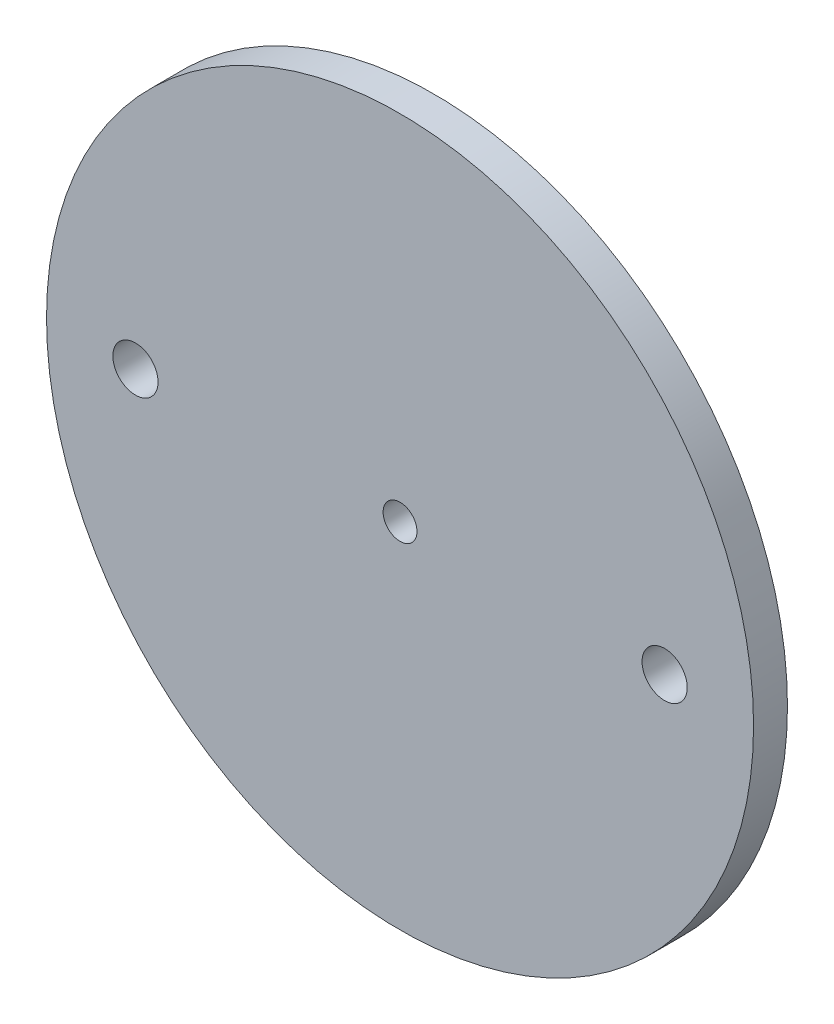
ISO-10303-21;
HEADER;
FILE_DESCRIPTION(('STEP AP214'),'2;1');
FILE_NAME('part.step','',(''),(''),'','','');
FILE_SCHEMA(('AUTOMOTIVE_DESIGN { 1 0 10303 214 1 1 1 1 }'));
ENDSEC;
DATA;
#1=APPLICATION_CONTEXT('core data for automotive mechanical design processes');
#2=APPLICATION_PROTOCOL_DEFINITION('international standard','automotive_design',2000,#1);
#3=PRODUCT_CONTEXT('',#1,'mechanical');
#4=PRODUCT('Part','Part','',(#3));
#5=PRODUCT_RELATED_PRODUCT_CATEGORY('part','',(#4));
#6=PRODUCT_DEFINITION_FORMATION('','',#4);
#7=PRODUCT_DEFINITION_CONTEXT('part definition',#1,'design');
#8=PRODUCT_DEFINITION('design','',#6,#7);
#9=PRODUCT_DEFINITION_SHAPE('','',#8);
#10=(LENGTH_UNIT() NAMED_UNIT(*) SI_UNIT(.MILLI.,.METRE.));
#11=(NAMED_UNIT(*) PLANE_ANGLE_UNIT() SI_UNIT($,.RADIAN.));
#12=(NAMED_UNIT(*) SI_UNIT($,.STERADIAN.) SOLID_ANGLE_UNIT());
#13=UNCERTAINTY_MEASURE_WITH_UNIT(LENGTH_MEASURE(1.E-05),#10,'distance_accuracy_value','');
#14=(GEOMETRIC_REPRESENTATION_CONTEXT(3) GLOBAL_UNCERTAINTY_ASSIGNED_CONTEXT((#13)) GLOBAL_UNIT_ASSIGNED_CONTEXT((#10,
#11,#12)) REPRESENTATION_CONTEXT('',''));
#15=CARTESIAN_POINT('',(0.,0.,0.));
#16=DIRECTION('',(0.,0.,1.));
#17=DIRECTION('',(1.,0.,0.));
#18=AXIS2_PLACEMENT_3D('',#15,#16,#17);
#19=CARTESIAN_POINT('',(0.,0.,4.7625));
#20=DIRECTION('',(0.,0.,-1.));
#21=DIRECTION('',(-1.,0.,0.));
#22=AXIS2_PLACEMENT_3D('',#19,#20,#21);
#23=CYLINDRICAL_SURFACE('',#22,49.6697);
#24=CARTESIAN_POINT('',(0.,0.,4.7625));
#25=DIRECTION('',(0.,0.,1.));
#26=DIRECTION('',(1.,0.,0.));
#27=AXIS2_PLACEMENT_3D('',#24,#25,#26);
#28=CIRCLE('',#27,49.6697);
#29=CARTESIAN_POINT('',(-49.6697,0.,4.7625));
#30=VERTEX_POINT('',#29);
#31=EDGE_CURVE('E10',#30,#30,#28,.T.);
#32=CARTESIAN_POINT('',(0.,0.,0.));
#33=DIRECTION('',(0.,0.,1.));
#34=DIRECTION('',(1.,0.,0.));
#35=AXIS2_PLACEMENT_3D('',#32,#33,#34);
#36=CIRCLE('',#35,49.6697);
#37=CARTESIAN_POINT('',(-49.6697,0.,0.));
#38=VERTEX_POINT('',#37);
#39=EDGE_CURVE('E37',#38,#38,#36,.T.);
#40=CARTESIAN_POINT('',(-49.6697,0.,4.7625));
#41=CARTESIAN_POINT('',(-49.6697,0.,4.712890625));
#42=CARTESIAN_POINT('',(-49.6697,0.,4.66328125));
#43=CARTESIAN_POINT('',(-49.6697,0.,4.5640625));
#44=CARTESIAN_POINT('',(-49.6697,0.,4.514453125));
#45=CARTESIAN_POINT('',(-49.6697,0.,4.415234375));
#46=CARTESIAN_POINT('',(-49.6697,0.,4.365625));
#47=CARTESIAN_POINT('',(-49.6697,0.,4.26640625));
#48=CARTESIAN_POINT('',(-49.6697,0.,4.216796875));
#49=CARTESIAN_POINT('',(-49.6697,0.,4.117578125));
#50=CARTESIAN_POINT('',(-49.6697,0.,4.06796875));
#51=CARTESIAN_POINT('',(-49.6697,0.,3.96875));
#52=CARTESIAN_POINT('',(-49.6697,0.,3.919140625));
#53=CARTESIAN_POINT('',(-49.6697,0.,3.819921875));
#54=CARTESIAN_POINT('',(-49.6697,0.,3.7703125));
#55=CARTESIAN_POINT('',(-49.6697,0.,3.67109375));
#56=CARTESIAN_POINT('',(-49.6697,0.,3.621484375));
#57=CARTESIAN_POINT('',(-49.6697,0.,3.522265625));
#58=CARTESIAN_POINT('',(-49.6697,0.,3.47265625));
#59=CARTESIAN_POINT('',(-49.6697,0.,3.3734375));
#60=CARTESIAN_POINT('',(-49.6697,0.,3.323828125));
#61=CARTESIAN_POINT('',(-49.6697,0.,3.224609375));
#62=CARTESIAN_POINT('',(-49.6697,0.,3.175));
#63=CARTESIAN_POINT('',(-49.6697,0.,3.07578125));
#64=CARTESIAN_POINT('',(-49.6697,0.,3.026171875));
#65=CARTESIAN_POINT('',(-49.6697,0.,2.926953125));
#66=CARTESIAN_POINT('',(-49.6697,0.,2.87734375));
#67=CARTESIAN_POINT('',(-49.6697,0.,2.778125));
#68=CARTESIAN_POINT('',(-49.6697,0.,2.728515625));
#69=CARTESIAN_POINT('',(-49.6697,0.,2.629296875));
#70=CARTESIAN_POINT('',(-49.6697,0.,2.5796875));
#71=CARTESIAN_POINT('',(-49.6697,0.,2.48046875));
#72=CARTESIAN_POINT('',(-49.6697,0.,2.430859375));
#73=CARTESIAN_POINT('',(-49.6697,0.,2.331640625));
#74=CARTESIAN_POINT('',(-49.6697,0.,2.28203125));
#75=CARTESIAN_POINT('',(-49.6697,0.,2.1828125));
#76=CARTESIAN_POINT('',(-49.6697,0.,2.133203125));
#77=CARTESIAN_POINT('',(-49.6697,0.,2.033984375));
#78=CARTESIAN_POINT('',(-49.6697,0.,1.984375));
#79=CARTESIAN_POINT('',(-49.6697,0.,1.88515625));
#80=CARTESIAN_POINT('',(-49.6697,0.,1.835546875));
#81=CARTESIAN_POINT('',(-49.6697,0.,1.736328125));
#82=CARTESIAN_POINT('',(-49.6697,0.,1.68671875));
#83=CARTESIAN_POINT('',(-49.6697,0.,1.5875));
#84=CARTESIAN_POINT('',(-49.6697,0.,1.537890625));
#85=CARTESIAN_POINT('',(-49.6697,0.,1.438671875));
#86=CARTESIAN_POINT('',(-49.6697,0.,1.3890625));
#87=CARTESIAN_POINT('',(-49.6697,0.,1.28984375));
#88=CARTESIAN_POINT('',(-49.6697,0.,1.240234375));
#89=CARTESIAN_POINT('',(-49.6697,0.,1.141015625));
#90=CARTESIAN_POINT('',(-49.6697,0.,1.09140625));
#91=CARTESIAN_POINT('',(-49.6697,0.,0.9921875));
#92=CARTESIAN_POINT('',(-49.6697,0.,0.942578125));
#93=CARTESIAN_POINT('',(-49.6697,0.,0.843359375));
#94=CARTESIAN_POINT('',(-49.6697,0.,0.79375));
#95=CARTESIAN_POINT('',(-49.6697,0.,0.69453125));
#96=CARTESIAN_POINT('',(-49.6697,0.,0.644921875));
#97=CARTESIAN_POINT('',(-49.6697,0.,0.545703125));
#98=CARTESIAN_POINT('',(-49.6697,0.,0.49609375));
#99=CARTESIAN_POINT('',(-49.6697,0.,0.396875));
#100=CARTESIAN_POINT('',(-49.6697,0.,0.347265625));
#101=CARTESIAN_POINT('',(-49.6697,0.,0.248046875));
#102=CARTESIAN_POINT('',(-49.6697,0.,0.1984375));
#103=CARTESIAN_POINT('',(-49.6697,0.,0.09921875));
#104=CARTESIAN_POINT('',(-49.6697,0.,0.049609375));
#105=CARTESIAN_POINT('',(-49.6697,0.,0.));
#106=B_SPLINE_CURVE_WITH_KNOTS('',3,(#40,#41,#42,#43,#44,#45,#46,#47,#48,#49,#50,#51,#52,#53,
#54,#55,#56,#57,#58,#59,#60,#61,#62,#63,#64,#65,#66,#67,#68,#69,#70,#71,#72,#73,#74,#75,#76,#77,
#78,#79,#80,#81,#82,#83,#84,#85,#86,#87,#88,#89,#90,#91,#92,#93,#94,#95,#96,#97,#98,#99,#100,
#101,#102,#103,#104,#105),.UNSPECIFIED.,.F.,.F.,(4,2,2,2,2,2,2,2,2,2,2,2,2,2,2,2,2,2,2,2,2,2,2,
2,2,2,2,2,2,2,2,2,4),(0.,0.148828124999999,0.297656249999999,0.446484374999999,
0.595312499999999,0.744140625,0.89296875,1.041796875,1.190625,1.339453125,1.48828125,
1.637109375,1.7859375,1.934765625,2.08359375,2.232421875,2.38125,2.530078125,2.67890625,
2.827734375,2.9765625,3.125390625,3.27421875,3.423046875,3.571875,3.720703125,3.86953125,
4.018359375,4.1671875,4.316015625,4.46484375,4.613671875,4.7625),.UNSPECIFIED.);
#107=EDGE_CURVE('BSEAM34',#30,#38,#106,.T.);
#108=ORIENTED_EDGE('',*,*,#31,.F.);
#109=ORIENTED_EDGE('',*,*,#39,.T.);
#110=ORIENTED_EDGE('',*,*,#107,.T.);
#111=ORIENTED_EDGE('',*,*,#107,.F.);
#112=EDGE_LOOP('',(#108,#110,#109,#111));
#113=FACE_BOUND('',#112,.T.);
#114=ADVANCED_FACE('F34',(#113),#23,.T.);
#115=CARTESIAN_POINT('',(0.,0.,4.7625));
#116=DIRECTION('',(0.,0.,1.));
#117=DIRECTION('',(1.,0.,0.));
#118=AXIS2_PLACEMENT_3D('',#115,#116,#117);
#119=PLANE('',#118);
#120=CARTESIAN_POINT('',(-37.1729,0.,4.7625));
#121=DIRECTION('',(0.,0.,1.));
#122=DIRECTION('',(1.,0.,0.));
#123=AXIS2_PLACEMENT_3D('',#120,#121,#122);
#124=CIRCLE('',#123,3.17500000000001);
#125=CARTESIAN_POINT('',(-33.9979,0.,4.7625));
#126=VERTEX_POINT('',#125);
#127=EDGE_CURVE('E58',#126,#126,#124,.T.);
#128=ORIENTED_EDGE('',*,*,#127,.F.);
#129=EDGE_LOOP('',(#128));
#130=FACE_BOUND('',#129,.T.);
#131=CARTESIAN_POINT('',(37.1729,0.,4.7625));
#132=DIRECTION('',(0.,0.,1.));
#133=DIRECTION('',(1.,0.,0.));
#134=AXIS2_PLACEMENT_3D('',#131,#132,#133);
#135=CIRCLE('',#134,3.17500000000001);
#136=CARTESIAN_POINT('',(40.3479,0.,4.7625));
#137=VERTEX_POINT('',#136);
#138=EDGE_CURVE('E52',#137,#137,#135,.T.);
#139=ORIENTED_EDGE('',*,*,#138,.F.);
#140=EDGE_LOOP('',(#139));
#141=FACE_BOUND('',#140,.T.);
#142=CARTESIAN_POINT('',(0.,0.,4.7625));
#143=DIRECTION('',(0.,0.,1.));
#144=DIRECTION('',(1.,0.,0.));
#145=AXIS2_PLACEMENT_3D('',#142,#143,#144);
#146=CIRCLE('',#145,2.38125);
#147=CARTESIAN_POINT('',(2.38125,0.,4.7625));
#148=VERTEX_POINT('',#147);
#149=EDGE_CURVE('E46',#148,#148,#146,.T.);
#150=ORIENTED_EDGE('',*,*,#149,.F.);
#151=EDGE_LOOP('',(#150));
#152=FACE_BOUND('',#151,.T.);
#153=ORIENTED_EDGE('',*,*,#31,.T.);
#154=EDGE_LOOP('',(#153));
#155=FACE_BOUND('',#154,.T.);
#156=ADVANCED_FACE('F74',(#130,#141,#152,#155),#119,.T.);
#157=CARTESIAN_POINT('',(0.,0.,0.));
#158=DIRECTION('',(0.,0.,1.));
#159=DIRECTION('',(1.,0.,0.));
#160=AXIS2_PLACEMENT_3D('',#157,#158,#159);
#161=PLANE('',#160);
#162=CARTESIAN_POINT('',(-37.1729,0.,0.));
#163=DIRECTION('',(0.,0.,1.));
#164=DIRECTION('',(1.,0.,0.));
#165=AXIS2_PLACEMENT_3D('',#162,#163,#164);
#166=CIRCLE('',#165,3.17500000000001);
#167=CARTESIAN_POINT('',(-33.9979,0.,0.));
#168=VERTEX_POINT('',#167);
#169=EDGE_CURVE('E55',#168,#168,#166,.T.);
#170=ORIENTED_EDGE('',*,*,#169,.T.);
#171=EDGE_LOOP('',(#170));
#172=FACE_BOUND('',#171,.T.);
#173=CARTESIAN_POINT('',(37.1729,0.,0.));
#174=DIRECTION('',(0.,0.,1.));
#175=DIRECTION('',(1.,0.,0.));
#176=AXIS2_PLACEMENT_3D('',#173,#174,#175);
#177=CIRCLE('',#176,3.17500000000001);
#178=CARTESIAN_POINT('',(40.3479,0.,0.));
#179=VERTEX_POINT('',#178);
#180=EDGE_CURVE('E49',#179,#179,#177,.T.);
#181=ORIENTED_EDGE('',*,*,#180,.T.);
#182=EDGE_LOOP('',(#181));
#183=FACE_BOUND('',#182,.T.);
#184=CARTESIAN_POINT('',(0.,0.,0.));
#185=DIRECTION('',(0.,0.,1.));
#186=DIRECTION('',(1.,0.,0.));
#187=AXIS2_PLACEMENT_3D('',#184,#185,#186);
#188=CIRCLE('',#187,2.38125);
#189=CARTESIAN_POINT('',(2.38125,0.,0.));
#190=VERTEX_POINT('',#189);
#191=EDGE_CURVE('E44',#190,#190,#188,.T.);
#192=ORIENTED_EDGE('',*,*,#191,.T.);
#193=EDGE_LOOP('',(#192));
#194=FACE_BOUND('',#193,.T.);
#195=ORIENTED_EDGE('',*,*,#39,.F.);
#196=EDGE_LOOP('',(#195));
#197=FACE_BOUND('',#196,.T.);
#198=ADVANCED_FACE('F64',(#172,#183,#194,#197),#161,.F.);
#199=CARTESIAN_POINT('',(0.,0.,0.));
#200=DIRECTION('',(0.,0.,1.));
#201=DIRECTION('',(1.,0.,0.));
#202=AXIS2_PLACEMENT_3D('',#199,#200,#201);
#203=CYLINDRICAL_SURFACE('',#202,2.38125);
#204=CARTESIAN_POINT('',(2.38125,0.,0.));
#205=CARTESIAN_POINT('',(2.38125,0.,0.049609375));
#206=CARTESIAN_POINT('',(2.38125,0.,0.09921875));
#207=CARTESIAN_POINT('',(2.38125,0.,0.1984375));
#208=CARTESIAN_POINT('',(2.38125,0.,0.248046875));
#209=CARTESIAN_POINT('',(2.38125,0.,0.347265625));
#210=CARTESIAN_POINT('',(2.38125,0.,0.396875));
#211=CARTESIAN_POINT('',(2.38125,0.,0.49609375));
#212=CARTESIAN_POINT('',(2.38125,0.,0.545703125));
#213=CARTESIAN_POINT('',(2.38125,0.,0.644921875));
#214=CARTESIAN_POINT('',(2.38125,0.,0.69453125));
#215=CARTESIAN_POINT('',(2.38125,0.,0.79375));
#216=CARTESIAN_POINT('',(2.38125,0.,0.843359375));
#217=CARTESIAN_POINT('',(2.38125,0.,0.942578125));
#218=CARTESIAN_POINT('',(2.38125,0.,0.9921875));
#219=CARTESIAN_POINT('',(2.38125,0.,1.09140625));
#220=CARTESIAN_POINT('',(2.38125,0.,1.141015625));
#221=CARTESIAN_POINT('',(2.38125,0.,1.240234375));
#222=CARTESIAN_POINT('',(2.38125,0.,1.28984375));
#223=CARTESIAN_POINT('',(2.38125,0.,1.3890625));
#224=CARTESIAN_POINT('',(2.38125,0.,1.438671875));
#225=CARTESIAN_POINT('',(2.38125,0.,1.537890625));
#226=CARTESIAN_POINT('',(2.38125,0.,1.5875));
#227=CARTESIAN_POINT('',(2.38125,0.,1.68671875));
#228=CARTESIAN_POINT('',(2.38125,0.,1.736328125));
#229=CARTESIAN_POINT('',(2.38125,0.,1.835546875));
#230=CARTESIAN_POINT('',(2.38125,0.,1.88515625));
#231=CARTESIAN_POINT('',(2.38125,0.,1.984375));
#232=CARTESIAN_POINT('',(2.38125,0.,2.033984375));
#233=CARTESIAN_POINT('',(2.38125,0.,2.133203125));
#234=CARTESIAN_POINT('',(2.38125,0.,2.1828125));
#235=CARTESIAN_POINT('',(2.38125,0.,2.28203125));
#236=CARTESIAN_POINT('',(2.38125,0.,2.331640625));
#237=CARTESIAN_POINT('',(2.38125,0.,2.430859375));
#238=CARTESIAN_POINT('',(2.38125,0.,2.48046875));
#239=CARTESIAN_POINT('',(2.38125,0.,2.5796875));
#240=CARTESIAN_POINT('',(2.38125,0.,2.629296875));
#241=CARTESIAN_POINT('',(2.38125,0.,2.728515625));
#242=CARTESIAN_POINT('',(2.38125,0.,2.778125));
#243=CARTESIAN_POINT('',(2.38125,0.,2.87734375));
#244=CARTESIAN_POINT('',(2.38125,0.,2.926953125));
#245=CARTESIAN_POINT('',(2.38125,0.,3.026171875));
#246=CARTESIAN_POINT('',(2.38125,0.,3.07578125));
#247=CARTESIAN_POINT('',(2.38125,0.,3.175));
#248=CARTESIAN_POINT('',(2.38125,0.,3.224609375));
#249=CARTESIAN_POINT('',(2.38125,0.,3.323828125));
#250=CARTESIAN_POINT('',(2.38125,0.,3.3734375));
#251=CARTESIAN_POINT('',(2.38125,0.,3.47265625));
#252=CARTESIAN_POINT('',(2.38125,0.,3.522265625));
#253=CARTESIAN_POINT('',(2.38125,0.,3.621484375));
#254=CARTESIAN_POINT('',(2.38125,0.,3.67109375));
#255=CARTESIAN_POINT('',(2.38125,0.,3.7703125));
#256=CARTESIAN_POINT('',(2.38125,0.,3.819921875));
#257=CARTESIAN_POINT('',(2.38125,0.,3.919140625));
#258=CARTESIAN_POINT('',(2.38125,0.,3.96875));
#259=CARTESIAN_POINT('',(2.38125,0.,4.06796875));
#260=CARTESIAN_POINT('',(2.38125,0.,4.117578125));
#261=CARTESIAN_POINT('',(2.38125,0.,4.216796875));
#262=CARTESIAN_POINT('',(2.38125,0.,4.26640625));
#263=CARTESIAN_POINT('',(2.38125,0.,4.365625));
#264=CARTESIAN_POINT('',(2.38125,0.,4.415234375));
#265=CARTESIAN_POINT('',(2.38125,0.,4.514453125));
#266=CARTESIAN_POINT('',(2.38125,0.,4.5640625));
#267=CARTESIAN_POINT('',(2.38125,0.,4.66328125));
#268=CARTESIAN_POINT('',(2.38125,0.,4.712890625));
#269=CARTESIAN_POINT('',(2.38125,0.,4.7625));
#270=B_SPLINE_CURVE_WITH_KNOTS('',3,(#204,#205,#206,#207,#208,#209,#210,#211,#212,#213,#214,
#215,#216,#217,#218,#219,#220,#221,#222,#223,#224,#225,#226,#227,#228,#229,#230,#231,#232,#233,
#234,#235,#236,#237,#238,#239,#240,#241,#242,#243,#244,#245,#246,#247,#248,#249,#250,#251,#252,
#253,#254,#255,#256,#257,#258,#259,#260,#261,#262,#263,#264,#265,#266,#267,#268,#269),
.UNSPECIFIED.,.F.,.F.,(4,2,2,2,2,2,2,2,2,2,2,2,2,2,2,2,2,2,2,2,2,2,2,2,2,2,2,2,2,2,2,2,4),(0.,
0.148828125,0.29765625,0.446484375,0.5953125,0.744140625,0.89296875,1.041796875,1.190625,
1.339453125,1.48828125,1.637109375,1.7859375,1.934765625,2.08359375,2.232421875,2.38125,
2.530078125,2.67890625,2.827734375,2.9765625,3.125390625,3.27421875,3.423046875,3.571875,
3.720703125,3.86953125,4.018359375,4.1671875,4.316015625,4.46484375,4.613671875,4.7625),.UNSPECIFIED.);
#271=EDGE_CURVE('BSEAM82',#190,#148,#270,.T.);
#272=ORIENTED_EDGE('',*,*,#191,.F.);
#273=ORIENTED_EDGE('',*,*,#149,.T.);
#274=ORIENTED_EDGE('',*,*,#271,.T.);
#275=ORIENTED_EDGE('',*,*,#271,.F.);
#276=EDGE_LOOP('',(#272,#274,#273,#275));
#277=FACE_BOUND('',#276,.T.);
#278=ADVANCED_FACE('F82',(#277),#203,.F.);
#279=CARTESIAN_POINT('',(37.1729,0.,0.));
#280=DIRECTION('',(0.,0.,1.));
#281=DIRECTION('',(1.,0.,0.));
#282=AXIS2_PLACEMENT_3D('',#279,#280,#281);
#283=CYLINDRICAL_SURFACE('',#282,3.17500000000001);
#284=CARTESIAN_POINT('',(40.3479,0.,0.));
#285=CARTESIAN_POINT('',(40.3479,0.,0.049609375));
#286=CARTESIAN_POINT('',(40.3479,0.,0.09921875));
#287=CARTESIAN_POINT('',(40.3479,0.,0.1984375));
#288=CARTESIAN_POINT('',(40.3479,0.,0.248046875));
#289=CARTESIAN_POINT('',(40.3479,0.,0.347265625));
#290=CARTESIAN_POINT('',(40.3479,0.,0.396875));
#291=CARTESIAN_POINT('',(40.3479,0.,0.49609375));
#292=CARTESIAN_POINT('',(40.3479,0.,0.545703125));
#293=CARTESIAN_POINT('',(40.3479,0.,0.644921875));
#294=CARTESIAN_POINT('',(40.3479,0.,0.69453125));
#295=CARTESIAN_POINT('',(40.3479,0.,0.79375));
#296=CARTESIAN_POINT('',(40.3479,0.,0.843359375));
#297=CARTESIAN_POINT('',(40.3479,0.,0.942578125));
#298=CARTESIAN_POINT('',(40.3479,0.,0.9921875));
#299=CARTESIAN_POINT('',(40.3479,0.,1.09140625));
#300=CARTESIAN_POINT('',(40.3479,0.,1.141015625));
#301=CARTESIAN_POINT('',(40.3479,0.,1.240234375));
#302=CARTESIAN_POINT('',(40.3479,0.,1.28984375));
#303=CARTESIAN_POINT('',(40.3479,0.,1.3890625));
#304=CARTESIAN_POINT('',(40.3479,0.,1.438671875));
#305=CARTESIAN_POINT('',(40.3479,0.,1.537890625));
#306=CARTESIAN_POINT('',(40.3479,0.,1.5875));
#307=CARTESIAN_POINT('',(40.3479,0.,1.68671875));
#308=CARTESIAN_POINT('',(40.3479,0.,1.736328125));
#309=CARTESIAN_POINT('',(40.3479,0.,1.835546875));
#310=CARTESIAN_POINT('',(40.3479,0.,1.88515625));
#311=CARTESIAN_POINT('',(40.3479,0.,1.984375));
#312=CARTESIAN_POINT('',(40.3479,0.,2.033984375));
#313=CARTESIAN_POINT('',(40.3479,0.,2.133203125));
#314=CARTESIAN_POINT('',(40.3479,0.,2.1828125));
#315=CARTESIAN_POINT('',(40.3479,0.,2.28203125));
#316=CARTESIAN_POINT('',(40.3479,0.,2.331640625));
#317=CARTESIAN_POINT('',(40.3479,0.,2.430859375));
#318=CARTESIAN_POINT('',(40.3479,0.,2.48046875));
#319=CARTESIAN_POINT('',(40.3479,0.,2.5796875));
#320=CARTESIAN_POINT('',(40.3479,0.,2.629296875));
#321=CARTESIAN_POINT('',(40.3479,0.,2.728515625));
#322=CARTESIAN_POINT('',(40.3479,0.,2.778125));
#323=CARTESIAN_POINT('',(40.3479,0.,2.87734375));
#324=CARTESIAN_POINT('',(40.3479,0.,2.926953125));
#325=CARTESIAN_POINT('',(40.3479,0.,3.026171875));
#326=CARTESIAN_POINT('',(40.3479,0.,3.07578125));
#327=CARTESIAN_POINT('',(40.3479,0.,3.175));
#328=CARTESIAN_POINT('',(40.3479,0.,3.224609375));
#329=CARTESIAN_POINT('',(40.3479,0.,3.323828125));
#330=CARTESIAN_POINT('',(40.3479,0.,3.3734375));
#331=CARTESIAN_POINT('',(40.3479,0.,3.47265625));
#332=CARTESIAN_POINT('',(40.3479,0.,3.522265625));
#333=CARTESIAN_POINT('',(40.3479,0.,3.621484375));
#334=CARTESIAN_POINT('',(40.3479,0.,3.67109375));
#335=CARTESIAN_POINT('',(40.3479,0.,3.7703125));
#336=CARTESIAN_POINT('',(40.3479,0.,3.819921875));
#337=CARTESIAN_POINT('',(40.3479,0.,3.919140625));
#338=CARTESIAN_POINT('',(40.3479,0.,3.96875));
#339=CARTESIAN_POINT('',(40.3479,0.,4.06796875));
#340=CARTESIAN_POINT('',(40.3479,0.,4.117578125));
#341=CARTESIAN_POINT('',(40.3479,0.,4.216796875));
#342=CARTESIAN_POINT('',(40.3479,0.,4.26640625));
#343=CARTESIAN_POINT('',(40.3479,0.,4.365625));
#344=CARTESIAN_POINT('',(40.3479,0.,4.415234375));
#345=CARTESIAN_POINT('',(40.3479,0.,4.514453125));
#346=CARTESIAN_POINT('',(40.3479,0.,4.5640625));
#347=CARTESIAN_POINT('',(40.3479,0.,4.66328125));
#348=CARTESIAN_POINT('',(40.3479,0.,4.712890625));
#349=CARTESIAN_POINT('',(40.3479,0.,4.7625));
#350=B_SPLINE_CURVE_WITH_KNOTS('',3,(#284,#285,#286,#287,#288,#289,#290,#291,#292,#293,#294,
#295,#296,#297,#298,#299,#300,#301,#302,#303,#304,#305,#306,#307,#308,#309,#310,#311,#312,#313,
#314,#315,#316,#317,#318,#319,#320,#321,#322,#323,#324,#325,#326,#327,#328,#329,#330,#331,#332,
#333,#334,#335,#336,#337,#338,#339,#340,#341,#342,#343,#344,#345,#346,#347,#348,#349),
.UNSPECIFIED.,.F.,.F.,(4,2,2,2,2,2,2,2,2,2,2,2,2,2,2,2,2,2,2,2,2,2,2,2,2,2,2,2,2,2,2,2,4),(0.,
0.148828125,0.29765625,0.446484375,0.5953125,0.744140625,0.89296875,1.041796875,1.190625,
1.339453125,1.48828125,1.637109375,1.7859375,1.934765625,2.08359375,2.232421875,2.38125,
2.530078125,2.67890625,2.827734375,2.9765625,3.125390625,3.27421875,3.423046875,3.571875,
3.720703125,3.86953125,4.018359375,4.1671875,4.316015625,4.46484375,4.613671875,4.7625),.UNSPECIFIED.);
#351=EDGE_CURVE('BSEAM70',#179,#137,#350,.T.);
#352=ORIENTED_EDGE('',*,*,#180,.F.);
#353=ORIENTED_EDGE('',*,*,#138,.T.);
#354=ORIENTED_EDGE('',*,*,#351,.T.);
#355=ORIENTED_EDGE('',*,*,#351,.F.);
#356=EDGE_LOOP('',(#352,#354,#353,#355));
#357=FACE_BOUND('',#356,.T.);
#358=ADVANCED_FACE('F70',(#357),#283,.F.);
#359=CARTESIAN_POINT('',(-37.1729,0.,0.));
#360=DIRECTION('',(0.,0.,1.));
#361=DIRECTION('',(1.,0.,0.));
#362=AXIS2_PLACEMENT_3D('',#359,#360,#361);
#363=CYLINDRICAL_SURFACE('',#362,3.17500000000001);
#364=CARTESIAN_POINT('',(-33.9979,0.,0.));
#365=CARTESIAN_POINT('',(-33.9979,0.,0.049609375));
#366=CARTESIAN_POINT('',(-33.9979,0.,0.09921875));
#367=CARTESIAN_POINT('',(-33.9979,0.,0.1984375));
#368=CARTESIAN_POINT('',(-33.9979,0.,0.248046875));
#369=CARTESIAN_POINT('',(-33.9979,0.,0.347265625));
#370=CARTESIAN_POINT('',(-33.9979,0.,0.396875));
#371=CARTESIAN_POINT('',(-33.9979,0.,0.49609375));
#372=CARTESIAN_POINT('',(-33.9979,0.,0.545703125));
#373=CARTESIAN_POINT('',(-33.9979,0.,0.644921875));
#374=CARTESIAN_POINT('',(-33.9979,0.,0.69453125));
#375=CARTESIAN_POINT('',(-33.9979,0.,0.79375));
#376=CARTESIAN_POINT('',(-33.9979,0.,0.843359375));
#377=CARTESIAN_POINT('',(-33.9979,0.,0.942578125));
#378=CARTESIAN_POINT('',(-33.9979,0.,0.9921875));
#379=CARTESIAN_POINT('',(-33.9979,0.,1.09140625));
#380=CARTESIAN_POINT('',(-33.9979,0.,1.141015625));
#381=CARTESIAN_POINT('',(-33.9979,0.,1.240234375));
#382=CARTESIAN_POINT('',(-33.9979,0.,1.28984375));
#383=CARTESIAN_POINT('',(-33.9979,0.,1.3890625));
#384=CARTESIAN_POINT('',(-33.9979,0.,1.438671875));
#385=CARTESIAN_POINT('',(-33.9979,0.,1.537890625));
#386=CARTESIAN_POINT('',(-33.9979,0.,1.5875));
#387=CARTESIAN_POINT('',(-33.9979,0.,1.68671875));
#388=CARTESIAN_POINT('',(-33.9979,0.,1.736328125));
#389=CARTESIAN_POINT('',(-33.9979,0.,1.835546875));
#390=CARTESIAN_POINT('',(-33.9979,0.,1.88515625));
#391=CARTESIAN_POINT('',(-33.9979,0.,1.984375));
#392=CARTESIAN_POINT('',(-33.9979,0.,2.033984375));
#393=CARTESIAN_POINT('',(-33.9979,0.,2.133203125));
#394=CARTESIAN_POINT('',(-33.9979,0.,2.1828125));
#395=CARTESIAN_POINT('',(-33.9979,0.,2.28203125));
#396=CARTESIAN_POINT('',(-33.9979,0.,2.331640625));
#397=CARTESIAN_POINT('',(-33.9979,0.,2.430859375));
#398=CARTESIAN_POINT('',(-33.9979,0.,2.48046875));
#399=CARTESIAN_POINT('',(-33.9979,0.,2.5796875));
#400=CARTESIAN_POINT('',(-33.9979,0.,2.629296875));
#401=CARTESIAN_POINT('',(-33.9979,0.,2.728515625));
#402=CARTESIAN_POINT('',(-33.9979,0.,2.778125));
#403=CARTESIAN_POINT('',(-33.9979,0.,2.87734375));
#404=CARTESIAN_POINT('',(-33.9979,0.,2.926953125));
#405=CARTESIAN_POINT('',(-33.9979,0.,3.026171875));
#406=CARTESIAN_POINT('',(-33.9979,0.,3.07578125));
#407=CARTESIAN_POINT('',(-33.9979,0.,3.175));
#408=CARTESIAN_POINT('',(-33.9979,0.,3.224609375));
#409=CARTESIAN_POINT('',(-33.9979,0.,3.323828125));
#410=CARTESIAN_POINT('',(-33.9979,0.,3.3734375));
#411=CARTESIAN_POINT('',(-33.9979,0.,3.47265625));
#412=CARTESIAN_POINT('',(-33.9979,0.,3.522265625));
#413=CARTESIAN_POINT('',(-33.9979,0.,3.621484375));
#414=CARTESIAN_POINT('',(-33.9979,0.,3.67109375));
#415=CARTESIAN_POINT('',(-33.9979,0.,3.7703125));
#416=CARTESIAN_POINT('',(-33.9979,0.,3.819921875));
#417=CARTESIAN_POINT('',(-33.9979,0.,3.919140625));
#418=CARTESIAN_POINT('',(-33.9979,0.,3.96875));
#419=CARTESIAN_POINT('',(-33.9979,0.,4.06796875));
#420=CARTESIAN_POINT('',(-33.9979,0.,4.117578125));
#421=CARTESIAN_POINT('',(-33.9979,0.,4.216796875));
#422=CARTESIAN_POINT('',(-33.9979,0.,4.26640625));
#423=CARTESIAN_POINT('',(-33.9979,0.,4.365625));
#424=CARTESIAN_POINT('',(-33.9979,0.,4.415234375));
#425=CARTESIAN_POINT('',(-33.9979,0.,4.514453125));
#426=CARTESIAN_POINT('',(-33.9979,0.,4.5640625));
#427=CARTESIAN_POINT('',(-33.9979,0.,4.66328125));
#428=CARTESIAN_POINT('',(-33.9979,0.,4.712890625));
#429=CARTESIAN_POINT('',(-33.9979,0.,4.7625));
#430=B_SPLINE_CURVE_WITH_KNOTS('',3,(#364,#365,#366,#367,#368,#369,#370,#371,#372,#373,#374,
#375,#376,#377,#378,#379,#380,#381,#382,#383,#384,#385,#386,#387,#388,#389,#390,#391,#392,#393,
#394,#395,#396,#397,#398,#399,#400,#401,#402,#403,#404,#405,#406,#407,#408,#409,#410,#411,#412,
#413,#414,#415,#416,#417,#418,#419,#420,#421,#422,#423,#424,#425,#426,#427,#428,#429),
.UNSPECIFIED.,.F.,.F.,(4,2,2,2,2,2,2,2,2,2,2,2,2,2,2,2,2,2,2,2,2,2,2,2,2,2,2,2,2,2,2,2,4),(0.,
0.148828125,0.29765625,0.446484375,0.5953125,0.744140625,0.89296875,1.041796875,1.190625,
1.339453125,1.48828125,1.637109375,1.7859375,1.934765625,2.08359375,2.232421875,2.38125,
2.530078125,2.67890625,2.827734375,2.9765625,3.125390625,3.27421875,3.423046875,3.571875,
3.720703125,3.86953125,4.018359375,4.1671875,4.316015625,4.46484375,4.613671875,4.7625),.UNSPECIFIED.);
#431=EDGE_CURVE('BSEAM67',#168,#126,#430,.T.);
#432=ORIENTED_EDGE('',*,*,#169,.F.);
#433=ORIENTED_EDGE('',*,*,#127,.T.);
#434=ORIENTED_EDGE('',*,*,#431,.T.);
#435=ORIENTED_EDGE('',*,*,#431,.F.);
#436=EDGE_LOOP('',(#432,#434,#433,#435));
#437=FACE_BOUND('',#436,.T.);
#438=ADVANCED_FACE('F67',(#437),#363,.F.);
#439=CLOSED_SHELL('',(#114,#156,#198,#278,#358,#438));
#440=MANIFOLD_SOLID_BREP('B2',#439);
#441=ADVANCED_BREP_SHAPE_REPRESENTATION('',(#18,#440),#14);
#442=SHAPE_DEFINITION_REPRESENTATION(#9,#441);
ENDSEC;
END-ISO-10303-21;
